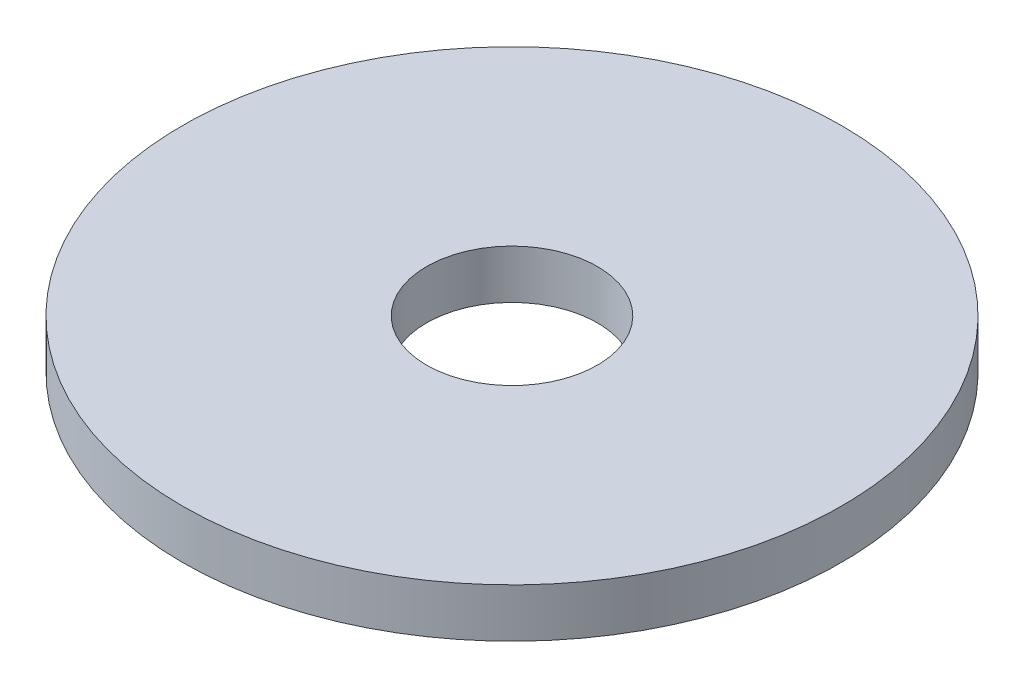
ISO-10303-21;
HEADER;
FILE_DESCRIPTION(('STEP AP214'),'2;1');
FILE_NAME('part.step','',(''),(''),'','','');
FILE_SCHEMA(('AUTOMOTIVE_DESIGN { 1 0 10303 214 1 1 1 1 }'));
ENDSEC;
DATA;
#1=APPLICATION_CONTEXT('core data for automotive mechanical design processes');
#2=APPLICATION_PROTOCOL_DEFINITION('international standard','automotive_design',2000,#1);
#3=PRODUCT_CONTEXT('',#1,'mechanical');
#4=PRODUCT('Part','Part','',(#3));
#5=PRODUCT_RELATED_PRODUCT_CATEGORY('part','',(#4));
#6=PRODUCT_DEFINITION_FORMATION('','',#4);
#7=PRODUCT_DEFINITION_CONTEXT('part definition',#1,'design');
#8=PRODUCT_DEFINITION('design','',#6,#7);
#9=PRODUCT_DEFINITION_SHAPE('','',#8);
#10=(LENGTH_UNIT() NAMED_UNIT(*) SI_UNIT(.MILLI.,.METRE.));
#11=(NAMED_UNIT(*) PLANE_ANGLE_UNIT() SI_UNIT($,.RADIAN.));
#12=(NAMED_UNIT(*) SI_UNIT($,.STERADIAN.) SOLID_ANGLE_UNIT());
#13=UNCERTAINTY_MEASURE_WITH_UNIT(LENGTH_MEASURE(1.E-05),#10,'distance_accuracy_value','');
#14=(GEOMETRIC_REPRESENTATION_CONTEXT(3) GLOBAL_UNCERTAINTY_ASSIGNED_CONTEXT((#13)) GLOBAL_UNIT_ASSIGNED_CONTEXT((#10,
#11,#12)) REPRESENTATION_CONTEXT('',''));
#15=CARTESIAN_POINT('',(0.,0.,0.));
#16=DIRECTION('',(0.,0.,1.));
#17=DIRECTION('',(1.,0.,0.));
#18=AXIS2_PLACEMENT_3D('',#15,#16,#17);
#19=CARTESIAN_POINT('',(0.,1.,0.));
#20=DIRECTION('',(0.,1.,0.));
#21=DIRECTION('',(0.,0.,1.));
#22=AXIS2_PLACEMENT_3D('',#19,#20,#21);
#23=PLANE('',#22);
#24=CARTESIAN_POINT('',(0.,1.,0.));
#25=DIRECTION('',(0.,1.,0.));
#26=DIRECTION('',(0.,0.,1.));
#27=AXIS2_PLACEMENT_3D('',#24,#25,#26);
#28=CIRCLE('',#27,6.75);
#29=CARTESIAN_POINT('',(0.,1.,6.75));
#30=VERTEX_POINT('',#29);
#31=EDGE_CURVE('E10',#30,#30,#28,.T.);
#32=ORIENTED_EDGE('',*,*,#31,.T.);
#33=EDGE_LOOP('',(#32));
#34=FACE_BOUND('',#33,.T.);
#35=CARTESIAN_POINT('',(0.,1.,0.));
#36=DIRECTION('',(0.,1.,0.));
#37=DIRECTION('',(0.,0.,1.));
#38=AXIS2_PLACEMENT_3D('',#35,#36,#37);
#39=CIRCLE('',#38,1.75);
#40=CARTESIAN_POINT('',(0.,1.,1.75));
#41=VERTEX_POINT('',#40);
#42=EDGE_CURVE('E56',#41,#41,#39,.T.);
#43=ORIENTED_EDGE('',*,*,#42,.F.);
#44=EDGE_LOOP('',(#43));
#45=FACE_BOUND('',#44,.T.);
#46=ADVANCED_FACE('F43',(#34,#45),#23,.T.);
#47=CARTESIAN_POINT('',(0.,0.,0.));
#48=DIRECTION('',(0.,1.,0.));
#49=DIRECTION('',(0.,0.,1.));
#50=AXIS2_PLACEMENT_3D('',#47,#48,#49);
#51=PLANE('',#50);
#52=CARTESIAN_POINT('',(0.,0.,0.));
#53=DIRECTION('',(0.,1.,0.));
#54=DIRECTION('',(0.,0.,1.));
#55=AXIS2_PLACEMENT_3D('',#52,#53,#54);
#56=CIRCLE('',#55,6.75);
#57=CARTESIAN_POINT('',(0.,0.,6.75));
#58=VERTEX_POINT('',#57);
#59=EDGE_CURVE('E47',#58,#58,#56,.T.);
#60=ORIENTED_EDGE('',*,*,#59,.F.);
#61=EDGE_LOOP('',(#60));
#62=FACE_BOUND('',#61,.T.);
#63=CARTESIAN_POINT('',(0.,0.,0.));
#64=DIRECTION('',(0.,1.,0.));
#65=DIRECTION('',(0.,0.,1.));
#66=AXIS2_PLACEMENT_3D('',#63,#64,#65);
#67=CIRCLE('',#66,1.75);
#68=CARTESIAN_POINT('',(0.,0.,1.75));
#69=VERTEX_POINT('',#68);
#70=EDGE_CURVE('E58',#69,#69,#67,.T.);
#71=ORIENTED_EDGE('',*,*,#70,.T.);
#72=EDGE_LOOP('',(#71));
#73=FACE_BOUND('',#72,.T.);
#74=ADVANCED_FACE('F70',(#62,#73),#51,.F.);
#75=CARTESIAN_POINT('',(0.,1.,0.));
#76=DIRECTION('',(0.,-1.,0.));
#77=DIRECTION('',(0.,0.,-1.));
#78=AXIS2_PLACEMENT_3D('',#75,#76,#77);
#79=CYLINDRICAL_SURFACE('',#78,6.75);
#80=ORIENTED_EDGE('',*,*,#31,.F.);
#81=EDGE_LOOP('',(#80));
#82=FACE_BOUND('',#81,.T.);
#83=ORIENTED_EDGE('',*,*,#59,.T.);
#84=EDGE_LOOP('',(#83));
#85=FACE_BOUND('',#84,.T.);
#86=ADVANCED_FACE('F45',(#82,#85),#79,.T.);
#87=CARTESIAN_POINT('',(0.,1.,0.));
#88=DIRECTION('',(0.,-1.,0.));
#89=DIRECTION('',(0.,0.,-1.));
#90=AXIS2_PLACEMENT_3D('',#87,#88,#89);
#91=CYLINDRICAL_SURFACE('',#90,1.75);
#92=ORIENTED_EDGE('',*,*,#42,.T.);
#93=EDGE_LOOP('',(#92));
#94=FACE_BOUND('',#93,.T.);
#95=ORIENTED_EDGE('',*,*,#70,.F.);
#96=EDGE_LOOP('',(#95));
#97=FACE_BOUND('',#96,.T.);
#98=ADVANCED_FACE('F66',(#94,#97),#91,.F.);
#99=CLOSED_SHELL('',(#46,#74,#86,#98));
#100=MANIFOLD_SOLID_BREP('B2',#99);
#101=ADVANCED_BREP_SHAPE_REPRESENTATION('',(#18,#100),#14);
#102=SHAPE_DEFINITION_REPRESENTATION(#9,#101);
ENDSEC;
END-ISO-10303-21;
